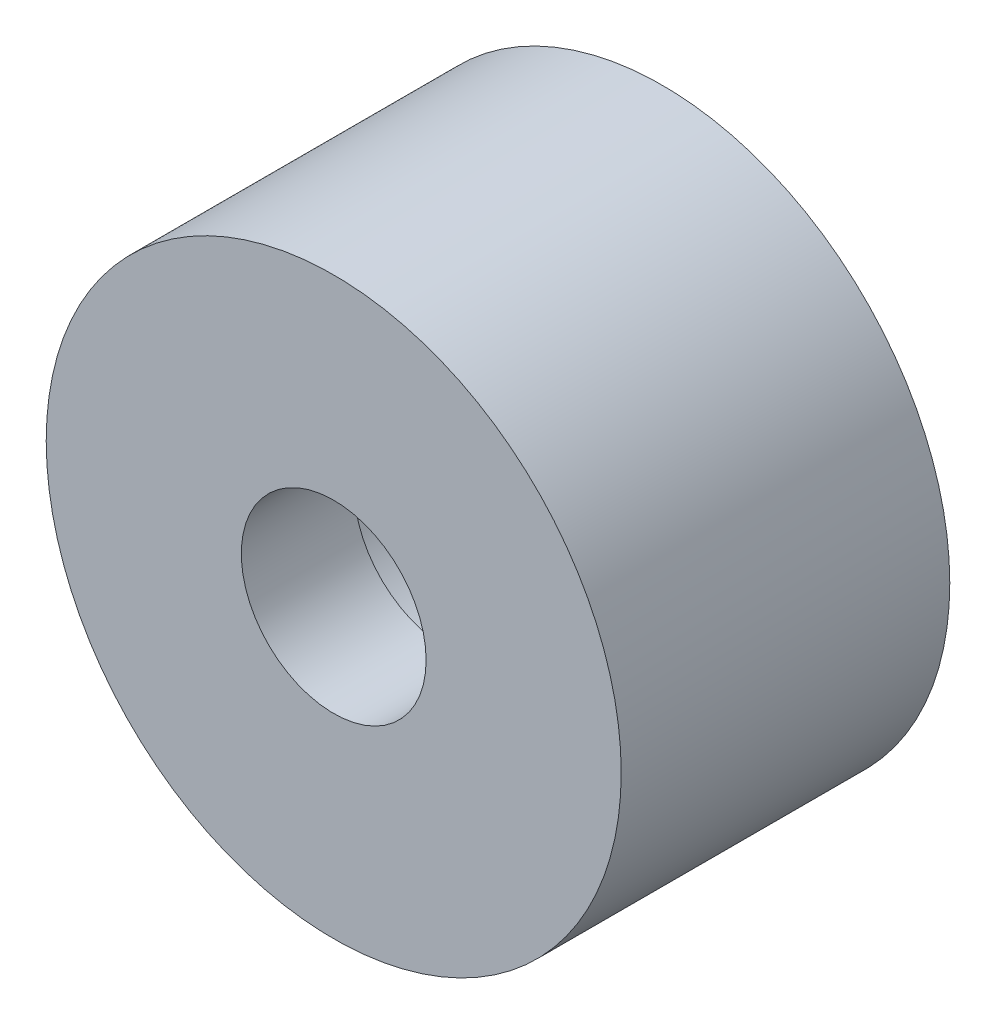
ISO-10303-21;
HEADER;
FILE_DESCRIPTION(('STEP AP214'),'2;1');
FILE_NAME('part.step','',(''),(''),'','','');
FILE_SCHEMA(('AUTOMOTIVE_DESIGN { 1 0 10303 214 1 1 1 1 }'));
ENDSEC;
DATA;
#1=APPLICATION_CONTEXT('core data for automotive mechanical design processes');
#2=APPLICATION_PROTOCOL_DEFINITION('international standard','automotive_design',2000,#1);
#3=PRODUCT_CONTEXT('',#1,'mechanical');
#4=PRODUCT('Part','Part','',(#3));
#5=PRODUCT_RELATED_PRODUCT_CATEGORY('part','',(#4));
#6=PRODUCT_DEFINITION_FORMATION('','',#4);
#7=PRODUCT_DEFINITION_CONTEXT('part definition',#1,'design');
#8=PRODUCT_DEFINITION('design','',#6,#7);
#9=PRODUCT_DEFINITION_SHAPE('','',#8);
#10=(LENGTH_UNIT() NAMED_UNIT(*) SI_UNIT(.MILLI.,.METRE.));
#11=(NAMED_UNIT(*) PLANE_ANGLE_UNIT() SI_UNIT($,.RADIAN.));
#12=(NAMED_UNIT(*) SI_UNIT($,.STERADIAN.) SOLID_ANGLE_UNIT());
#13=UNCERTAINTY_MEASURE_WITH_UNIT(LENGTH_MEASURE(1.E-05),#10,'distance_accuracy_value','');
#14=(GEOMETRIC_REPRESENTATION_CONTEXT(3) GLOBAL_UNCERTAINTY_ASSIGNED_CONTEXT((#13)) GLOBAL_UNIT_ASSIGNED_CONTEXT((#10,
#11,#12)) REPRESENTATION_CONTEXT('',''));
#15=CARTESIAN_POINT('',(0.,0.,0.));
#16=DIRECTION('',(0.,0.,1.));
#17=DIRECTION('',(1.,0.,0.));
#18=AXIS2_PLACEMENT_3D('',#15,#16,#17);
#19=CARTESIAN_POINT('',(0.,0.,32.));
#20=DIRECTION('',(0.,0.,-1.));
#21=DIRECTION('',(-1.,0.,0.));
#22=AXIS2_PLACEMENT_3D('',#19,#20,#21);
#23=PLANE('',#22);
#24=CARTESIAN_POINT('',(0.,0.,32.));
#25=DIRECTION('',(0.,0.,1.));
#26=DIRECTION('',(1.,0.,0.));
#27=AXIS2_PLACEMENT_3D('',#24,#25,#26);
#28=CIRCLE('',#27,28.);
#29=CARTESIAN_POINT('',(28.,0.,32.));
#30=VERTEX_POINT('',#29);
#31=EDGE_CURVE('E45',#30,#30,#28,.T.);
#32=ORIENTED_EDGE('',*,*,#31,.T.);
#33=EDGE_LOOP('',(#32));
#34=FACE_BOUND('',#33,.T.);
#35=CARTESIAN_POINT('',(0.,0.,32.));
#36=DIRECTION('',(0.,0.,1.));
#37=DIRECTION('',(1.,0.,0.));
#38=AXIS2_PLACEMENT_3D('',#35,#36,#37);
#39=CIRCLE('',#38,9.);
#40=CARTESIAN_POINT('',(9.,0.,32.));
#41=VERTEX_POINT('',#40);
#42=EDGE_CURVE('E89',#41,#41,#39,.T.);
#43=ORIENTED_EDGE('',*,*,#42,.F.);
#44=EDGE_LOOP('',(#43));
#45=FACE_BOUND('',#44,.T.);
#46=ADVANCED_FACE('F79',(#34,#45),#23,.F.);
#47=CARTESIAN_POINT('',(0.,28.,0.));
#48=DIRECTION('',(0.,0.,1.));
#49=DIRECTION('',(1.,0.,0.));
#50=AXIS2_PLACEMENT_3D('',#47,#48,#49);
#51=PLANE('',#50);
#52=CARTESIAN_POINT('',(0.,0.,0.));
#53=DIRECTION('',(0.,0.,1.));
#54=DIRECTION('',(1.,0.,0.));
#55=AXIS2_PLACEMENT_3D('',#52,#53,#54);
#56=CIRCLE('',#55,28.);
#57=CARTESIAN_POINT('',(28.,0.,0.));
#58=VERTEX_POINT('',#57);
#59=EDGE_CURVE('E85',#58,#58,#56,.T.);
#60=ORIENTED_EDGE('',*,*,#59,.F.);
#61=EDGE_LOOP('',(#60));
#62=FACE_BOUND('',#61,.T.);
#63=CARTESIAN_POINT('',(0.,0.,0.));
#64=DIRECTION('',(0.,0.,1.));
#65=DIRECTION('',(1.,0.,0.));
#66=AXIS2_PLACEMENT_3D('',#63,#64,#65);
#67=CIRCLE('',#66,13.);
#68=CARTESIAN_POINT('',(13.,0.,0.));
#69=VERTEX_POINT('',#68);
#70=EDGE_CURVE('E101',#69,#69,#67,.T.);
#71=ORIENTED_EDGE('',*,*,#70,.T.);
#72=EDGE_LOOP('',(#71));
#73=FACE_BOUND('',#72,.T.);
#74=ADVANCED_FACE('F105',(#62,#73),#51,.F.);
#75=CARTESIAN_POINT('',(0.,0.,0.));
#76=DIRECTION('',(0.,0.,1.));
#77=DIRECTION('',(1.,0.,0.));
#78=AXIS2_PLACEMENT_3D('',#75,#76,#77);
#79=CYLINDRICAL_SURFACE('',#78,28.);
#80=ORIENTED_EDGE('',*,*,#31,.F.);
#81=EDGE_LOOP('',(#80));
#82=FACE_BOUND('',#81,.T.);
#83=ORIENTED_EDGE('',*,*,#59,.T.);
#84=EDGE_LOOP('',(#83));
#85=FACE_BOUND('',#84,.T.);
#86=ADVANCED_FACE('F122',(#82,#85),#79,.T.);
#87=CARTESIAN_POINT('',(0.,0.,0.));
#88=DIRECTION('',(0.,0.,1.));
#89=DIRECTION('',(1.,0.,0.));
#90=AXIS2_PLACEMENT_3D('',#87,#88,#89);
#91=CYLINDRICAL_SURFACE('',#90,9.);
#92=ORIENTED_EDGE('',*,*,#42,.T.);
#93=EDGE_LOOP('',(#92));
#94=FACE_BOUND('',#93,.T.);
#95=CARTESIAN_POINT('',(0.,0.,21.));
#96=DIRECTION('',(0.,0.,1.));
#97=DIRECTION('',(1.,0.,0.));
#98=AXIS2_PLACEMENT_3D('',#95,#96,#97);
#99=CIRCLE('',#98,9.);
#100=CARTESIAN_POINT('',(9.,0.,21.));
#101=VERTEX_POINT('',#100);
#102=EDGE_CURVE('E93',#101,#101,#99,.T.);
#103=ORIENTED_EDGE('',*,*,#102,.F.);
#104=EDGE_LOOP('',(#103));
#105=FACE_BOUND('',#104,.T.);
#106=ADVANCED_FACE('F115',(#94,#105),#91,.F.);
#107=CARTESIAN_POINT('',(0.,9.,21.));
#108=DIRECTION('',(0.,0.,-1.));
#109=DIRECTION('',(-1.,0.,0.));
#110=AXIS2_PLACEMENT_3D('',#107,#108,#109);
#111=PLANE('',#110);
#112=ORIENTED_EDGE('',*,*,#102,.T.);
#113=EDGE_LOOP('',(#112));
#114=FACE_BOUND('',#113,.T.);
#115=CARTESIAN_POINT('',(0.,0.,21.));
#116=DIRECTION('',(0.,0.,1.));
#117=DIRECTION('',(1.,0.,0.));
#118=AXIS2_PLACEMENT_3D('',#115,#116,#117);
#119=CIRCLE('',#118,13.);
#120=CARTESIAN_POINT('',(13.,0.,21.));
#121=VERTEX_POINT('',#120);
#122=EDGE_CURVE('E98',#121,#121,#119,.T.);
#123=ORIENTED_EDGE('',*,*,#122,.F.);
#124=EDGE_LOOP('',(#123));
#125=FACE_BOUND('',#124,.T.);
#126=ADVANCED_FACE('F109',(#114,#125),#111,.T.);
#127=CARTESIAN_POINT('',(0.,0.,0.));
#128=DIRECTION('',(0.,0.,1.));
#129=DIRECTION('',(1.,0.,0.));
#130=AXIS2_PLACEMENT_3D('',#127,#128,#129);
#131=CYLINDRICAL_SURFACE('',#130,13.);
#132=ORIENTED_EDGE('',*,*,#122,.T.);
#133=EDGE_LOOP('',(#132));
#134=FACE_BOUND('',#133,.T.);
#135=ORIENTED_EDGE('',*,*,#70,.F.);
#136=EDGE_LOOP('',(#135));
#137=FACE_BOUND('',#136,.T.);
#138=ADVANCED_FACE('F107',(#134,#137),#131,.F.);
#139=CLOSED_SHELL('',(#46,#74,#86,#106,#126,#138));
#140=MANIFOLD_SOLID_BREP('B6',#139);
#141=ADVANCED_BREP_SHAPE_REPRESENTATION('',(#18,#140),#14);
#142=SHAPE_DEFINITION_REPRESENTATION(#9,#141);
ENDSEC;
END-ISO-10303-21;
